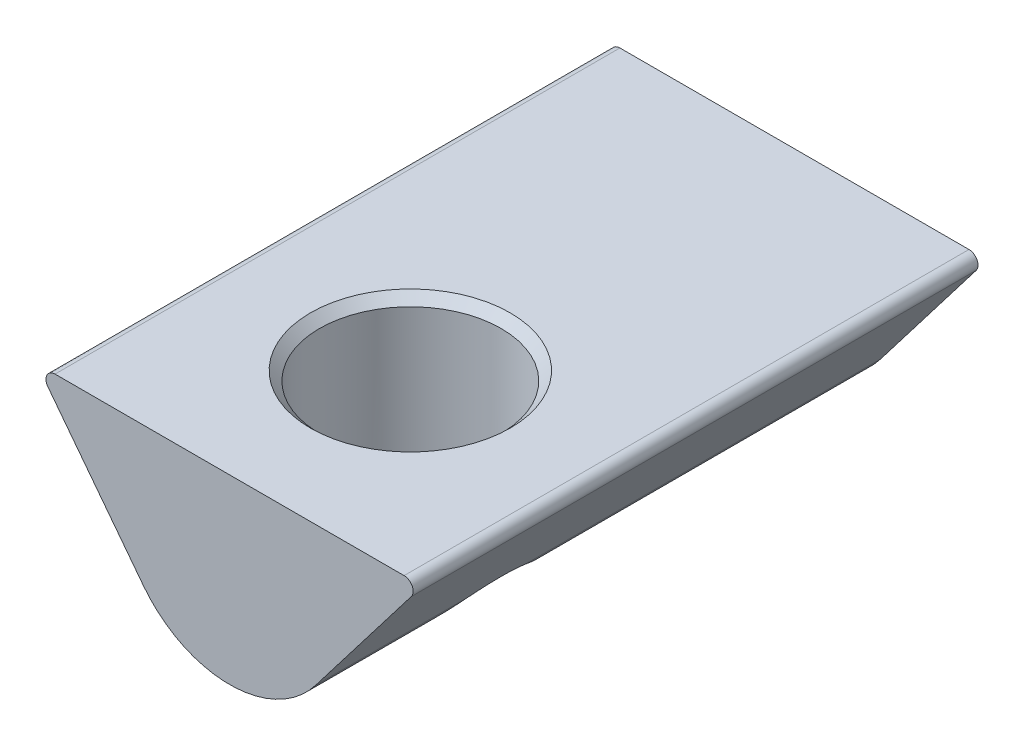
ISO-10303-21;
HEADER;
FILE_DESCRIPTION(('STEP AP214'),'2;1');
FILE_NAME('part.step','',(''),(''),'','','');
FILE_SCHEMA(('AUTOMOTIVE_DESIGN { 1 0 10303 214 1 1 1 1 }'));
ENDSEC;
DATA;
#1=APPLICATION_CONTEXT('core data for automotive mechanical design processes');
#2=APPLICATION_PROTOCOL_DEFINITION('international standard','automotive_design',2000,#1);
#3=PRODUCT_CONTEXT('',#1,'mechanical');
#4=PRODUCT('Part','Part','',(#3));
#5=PRODUCT_RELATED_PRODUCT_CATEGORY('part','',(#4));
#6=PRODUCT_DEFINITION_FORMATION('','',#4);
#7=PRODUCT_DEFINITION_CONTEXT('part definition',#1,'design');
#8=PRODUCT_DEFINITION('design','',#6,#7);
#9=PRODUCT_DEFINITION_SHAPE('','',#8);
#10=(LENGTH_UNIT() NAMED_UNIT(*) SI_UNIT(.MILLI.,.METRE.));
#11=(NAMED_UNIT(*) PLANE_ANGLE_UNIT() SI_UNIT($,.RADIAN.));
#12=(NAMED_UNIT(*) SI_UNIT($,.STERADIAN.) SOLID_ANGLE_UNIT());
#13=UNCERTAINTY_MEASURE_WITH_UNIT(LENGTH_MEASURE(1.E-05),#10,'distance_accuracy_value','');
#14=(GEOMETRIC_REPRESENTATION_CONTEXT(3) GLOBAL_UNCERTAINTY_ASSIGNED_CONTEXT((#13)) GLOBAL_UNIT_ASSIGNED_CONTEXT((#10,
#11,#12)) REPRESENTATION_CONTEXT('',''));
#15=CARTESIAN_POINT('',(0.,0.,0.));
#16=DIRECTION('',(0.,0.,1.));
#17=DIRECTION('',(1.,0.,0.));
#18=AXIS2_PLACEMENT_3D('',#15,#16,#17);
#19=CARTESIAN_POINT('',(20.678846244995,21.2515591218963,15.875));
#20=DIRECTION('',(0.,0.,-1.));
#21=DIRECTION('',(-1.,0.,0.));
#22=AXIS2_PLACEMENT_3D('',#19,#20,#21);
#23=CYLINDRICAL_SURFACE('',#22,3.04987684764088);
#24=DIRECTION('',(0.,0.,-1.));
#25=VECTOR('',#24,1.);
#26=CARTESIAN_POINT('',(23.0984762297093,19.3949117340363,15.875));
#27=LINE('',#26,#25);
#28=CARTESIAN_POINT('',(23.0984762297093,19.3949117340363,9.98157020765669));
#29=VERTEX_POINT('',#28);
#30=CARTESIAN_POINT('',(23.0984762297093,19.3949117340363,0.));
#31=VERTEX_POINT('',#30);
#32=EDGE_CURVE('E152',#29,#31,#27,.T.);
#33=ORIENTED_EDGE('',*,*,#32,.F.);
#34=CARTESIAN_POINT('',(23.0984762297093,19.3949117340363,9.98157020765669));
#35=CARTESIAN_POINT('',(23.0729910607301,19.3616518093463,9.90588643650475));
#36=CARTESIAN_POINT('',(23.0444060362908,19.3258576982573,9.832494447542));
#37=CARTESIAN_POINT('',(22.9813863376244,19.2509596465722,9.69015156439314));
#38=CARTESIAN_POINT('',(22.9469589409931,19.2118598537659,9.62119529042967));
#39=CARTESIAN_POINT('',(22.8723147344973,19.1317765949265,9.48699035002589));
#40=CARTESIAN_POINT('',(22.8320641401536,19.0907831589226,9.42176665435686));
#41=CARTESIAN_POINT('',(22.7460193493294,19.0083261210263,9.29535865730705));
#42=CARTESIAN_POINT('',(22.7002231329875,18.9668623528402,9.23417584033539));
#43=CARTESIAN_POINT('',(22.6032976497361,18.8846503298943,9.11614078498057));
#44=CARTESIAN_POINT('',(22.5521886465642,18.8439000022675,9.05927342636744));
#45=CARTESIAN_POINT('',(22.4445370571206,18.7638702036827,8.94986823668342));
#46=CARTESIAN_POINT('',(22.3879947577308,18.7245906552186,8.89733017729432));
#47=CARTESIAN_POINT('',(22.2104529149698,18.6104201269046,8.74697163006513));
#48=CARTESIAN_POINT('',(22.0811669320783,18.5388685265395,8.65594896207072));
#49=CARTESIAN_POINT('',(21.8404423962583,18.4293540410149,8.51892034650207));
#50=CARTESIAN_POINT('',(21.7338464253532,18.3875624813369,8.46741588720267));
#51=CARTESIAN_POINT('',(21.5111964971386,18.3151330569238,8.37884955454632));
#52=CARTESIAN_POINT('',(21.3951490972065,18.2844875384294,8.3417777693297));
#53=CARTESIAN_POINT('',(21.1553814938514,18.2366466756989,8.2841264460102));
#54=CARTESIAN_POINT('',(21.0316131754071,18.2195471948586,8.26366442821258));
#55=CARTESIAN_POINT('',(20.7812528215214,18.2008239512615,8.24126661766402));
#56=CARTESIAN_POINT('',(20.6546621812725,18.1991927047836,8.2393218660312));
#57=CARTESIAN_POINT('',(20.4173098302928,18.2108521691151,8.2532612940785));
#58=CARTESIAN_POINT('',(20.3063433499783,18.2225155732538,8.26720109630907));
#59=CARTESIAN_POINT('',(20.0889363113797,18.2572517185322,8.30893106453424));
#60=CARTESIAN_POINT('',(19.982495977392,18.280325024384,8.33672191606155));
#61=CARTESIAN_POINT('',(19.7738149784183,18.3369984330871,8.40552658988044));
#62=CARTESIAN_POINT('',(19.6717495237704,18.3708509017565,8.44685818339581));
#63=CARTESIAN_POINT('',(19.4762364008337,18.4468305001562,8.54071788091777));
#64=CARTESIAN_POINT('',(19.3827947720185,18.4889633651869,8.59325374756731));
#65=CARTESIAN_POINT('',(19.1643469656639,18.6002931042267,8.73431833028964));
#66=CARTESIAN_POINT('',(19.0446378094254,18.6730145319431,8.82827706066428));
#67=CARTESIAN_POINT('',(18.8256513904151,18.8256043885582,9.0330331117077));
#68=CARTESIAN_POINT('',(18.7264195071988,18.9054881400203,9.14386690494887));
#69=CARTESIAN_POINT('',(18.5972784941784,19.0218107021475,9.31586517702937));
#70=CARTESIAN_POINT('',(18.5591157569316,19.0581401224603,9.37108218490253));
#71=CARTESIAN_POINT('',(18.4870869784042,19.1301141326462,9.48466009959388));
#72=CARTESIAN_POINT('',(18.4532192518818,19.1657589864363,9.54301976043827));
#73=CARTESIAN_POINT('',(18.3900002431264,19.2353440400592,9.66273135402388));
#74=CARTESIAN_POINT('',(18.3606306730431,19.2692907428314,9.72406975867521));
#75=CARTESIAN_POINT('',(18.3064389094072,19.3344619169196,9.85020063857088));
#76=CARTESIAN_POINT('',(18.2816220673024,19.3656831623309,9.9149970645228));
#77=CARTESIAN_POINT('',(18.2592162602807,19.3949117340363,9.98157020765668));
#78=B_SPLINE_CURVE_WITH_KNOTS('',3,(#34,#35,#36,#37,#38,#39,#40,#41,#42,#43,#44,#45,#46,#47,#48,
#49,#50,#51,#52,#53,#54,#55,#56,#57,#58,#59,#60,#61,#62,#63,#64,#65,#66,#67,#68,#69,#70,#71,#72,
#73,#74,#75,#76,#77),.UNSPECIFIED.,.F.,.F.,(4,2,2,2,2,2,2,2,2,2,2,2,2,2,2,2,2,2,2,2,2,4),(0.,
0.259236084048795,0.518151587682971,0.778634429249544,1.03921243250584,1.29883068515625,
1.55843523730723,2.07564312141208,2.45087772932179,2.82585418261333,3.20346115922281,
3.58088543562899,3.9166471395847,4.2524254631108,4.59672793118124,4.94126972137637,
5.4445819506972,5.9489978645265,6.17782191071443,6.4065558931287,6.63433372083004,
6.86237759526639),.UNSPECIFIED.);
#79=CARTESIAN_POINT('',(18.2592162602807,19.3949117340363,9.98157020765669));
#80=VERTEX_POINT('',#79);
#81=EDGE_CURVE('E161',#29,#80,#78,.T.);
#82=ORIENTED_EDGE('',*,*,#81,.T.);
#83=DIRECTION('',(0.,0.,-1.));
#84=VECTOR('',#83,1.);
#85=CARTESIAN_POINT('',(18.2592162602807,19.3949117340363,15.875));
#86=LINE('',#85,#84);
#87=CARTESIAN_POINT('',(18.2592162602807,19.3949117340363,0.));
#88=VERTEX_POINT('',#87);
#89=EDGE_CURVE('E86',#80,#88,#86,.T.);
#90=ORIENTED_EDGE('',*,*,#89,.T.);
#91=CARTESIAN_POINT('',(20.678846244995,21.2515591218963,0.));
#92=DIRECTION('',(0.,0.,1.));
#93=DIRECTION('',(1.,0.,0.));
#94=AXIS2_PLACEMENT_3D('',#91,#92,#93);
#95=CIRCLE('',#94,3.04987684764088);
#96=EDGE_CURVE('E132',#88,#31,#95,.T.);
#97=ORIENTED_EDGE('',*,*,#96,.T.);
#98=EDGE_LOOP('',(#33,#82,#90,#97));
#99=FACE_BOUND('',#98,.T.);
#100=ADVANCED_FACE('F34',(#99),#23,.T.);
#101=CARTESIAN_POINT('',(18.2592162602807,19.3949117340363,15.875));
#102=VERTEX_POINT('',#101);
#103=CARTESIAN_POINT('',(18.2592162602807,19.3949117340363,11.6084297923433));
#104=VERTEX_POINT('',#103);
#105=EDGE_CURVE('E144',#102,#104,#86,.T.);
#106=ORIENTED_EDGE('',*,*,#105,.T.);
#107=CARTESIAN_POINT('',(18.2592162602807,19.3949117340363,11.6084297923433));
#108=CARTESIAN_POINT('',(18.2847014797293,19.3616517457281,11.6841137068755));
#109=CARTESIAN_POINT('',(18.3132865632125,19.3258575621394,11.7575058306976));
#110=CARTESIAN_POINT('',(18.3763064232477,19.2509593304373,11.8998490163147));
#111=CARTESIAN_POINT('',(18.4107339262214,19.2118594278203,11.9688054549172));
#112=CARTESIAN_POINT('',(18.4853782161445,19.1317761221928,12.1030104108276));
#113=CARTESIAN_POINT('',(18.5256287631642,19.0907827564625,12.1682339754314));
#114=CARTESIAN_POINT('',(18.6116733779941,19.008325899951,12.2946416687591));
#115=CARTESIAN_POINT('',(18.657469460795,18.9668622432775,12.3558243166468));
#116=CARTESIAN_POINT('',(18.7543913953415,18.8846532733081,12.4738549893639));
#117=CARTESIAN_POINT('',(18.8054966051926,18.8439058484992,12.5307184163364));
#118=CARTESIAN_POINT('',(18.913139638289,18.7638814793328,12.640116513459));
#119=CARTESIAN_POINT('',(18.9696771902149,18.7246044616715,12.6926513995556));
#120=CARTESIAN_POINT('',(19.1472220578543,18.6104302114162,12.8430155734873));
#121=CARTESIAN_POINT('',(19.2765196632129,18.5388728972368,12.9340456834417));
#122=CARTESIAN_POINT('',(19.5172858855283,18.429336532266,13.0711014781538));
#123=CARTESIAN_POINT('',(19.6239179831347,18.3875308210941,13.1226228571068));
#124=CARTESIAN_POINT('',(19.8465946531842,18.3151092067903,13.2111795761877));
#125=CARTESIAN_POINT('',(19.9626253462688,18.284477158277,13.248235823183));
#126=CARTESIAN_POINT('',(20.178456167469,18.2414016081892,13.300142678288));
#127=CARTESIAN_POINT('',(20.2770920493922,18.2265944094534,13.3178916162994));
#128=CARTESIAN_POINT('',(20.476757042617,18.2067323804414,13.3416726954326));
#129=CARTESIAN_POINT('',(20.577786155835,18.2016775579756,13.3477048271708));
#130=CARTESIAN_POINT('',(20.7999445734233,18.2016879256814,13.3476942156956));
#131=CARTESIAN_POINT('',(20.9210873794638,18.2089584474673,13.3390201068566));
#132=CARTESIAN_POINT('',(21.1593303044648,18.2373732312429,13.304966191829));
#133=CARTESIAN_POINT('',(21.2764273747776,18.2585277253507,13.2795740648622));
#134=CARTESIAN_POINT('',(21.5025947314249,18.3127427793439,13.2139890918811));
#135=CARTESIAN_POINT('',(21.6117091048076,18.3457308806922,13.1738862879987));
#136=CARTESIAN_POINT('',(21.8207254006519,18.4213224447704,13.0809346902221));
#137=CARTESIAN_POINT('',(21.9206225432387,18.4639308573643,13.0280793338921));
#138=CARTESIAN_POINT('',(22.1452539462075,18.5734534042563,12.8900316055631));
#139=CARTESIAN_POINT('',(22.2655297977446,18.6435316430247,12.8001066143267));
#140=CARTESIAN_POINT('',(22.4863887933145,18.7914287098241,12.6035974549958));
#141=CARTESIAN_POINT('',(22.5869244285369,18.869265548475,12.49697418037));
#142=CARTESIAN_POINT('',(22.7228408234887,18.9871699193447,12.3259066923562));
#143=CARTESIAN_POINT('',(22.765725848323,19.0267317839839,12.2669179115891));
#144=CARTESIAN_POINT('',(22.8464405998986,19.1052943213047,12.1452373816163));
#145=CARTESIAN_POINT('',(22.8842720890144,19.144295185374,12.0825469343894));
#146=CARTESIAN_POINT('',(22.9546281179721,19.2204933561365,11.953651454112));
#147=CARTESIAN_POINT('',(22.9871756764517,19.2576979608229,11.8874634269242));
#148=CARTESIAN_POINT('',(23.0469243763552,19.3290179088633,11.7510290354236));
#149=CARTESIAN_POINT('',(23.0741190826844,19.3631295076275,11.6807779161695));
#150=CARTESIAN_POINT('',(23.0984762297093,19.3949117340363,11.6084297923433));
#151=B_SPLINE_CURVE_WITH_KNOTS('',3,(#107,#108,#109,#110,#111,#112,#113,#114,#115,#116,#117,
#118,#119,#120,#121,#122,#123,#124,#125,#126,#127,#128,#129,#130,#131,#132,#133,#134,#135,#136,
#137,#138,#139,#140,#141,#142,#143,#144,#145,#146,#147,#148,#149,#150),.UNSPECIFIED.,.F.,.F.,(4,
2,2,2,2,2,2,2,2,2,2,2,2,2,2,2,2,2,2,2,2,4),(0.,0.259236575146356,0.518152747534118,
0.778635123492828,1.03921243228896,1.2988120593017,1.55839872729532,2.0756430014301,
2.45102085045048,2.82585412837456,3.12867762974668,3.43150137364087,3.79436914368525,
4.15750463836186,4.51845353855625,4.87958857992117,5.37413899771829,5.86986544191163,
6.11858384178819,6.36721527567163,6.614732700698,6.86254589296833),.UNSPECIFIED.);
#152=CARTESIAN_POINT('',(23.0984762297093,19.3949117340363,11.6084297923433));
#153=VERTEX_POINT('',#152);
#154=EDGE_CURVE('E155',#104,#153,#151,.T.);
#155=ORIENTED_EDGE('',*,*,#154,.T.);
#156=CARTESIAN_POINT('',(23.0984762297093,19.3949117340363,15.875));
#157=VERTEX_POINT('',#156);
#158=EDGE_CURVE('E153',#157,#153,#27,.T.);
#159=ORIENTED_EDGE('',*,*,#158,.F.);
#160=CARTESIAN_POINT('',(20.678846244995,21.2515591218963,15.875));
#161=DIRECTION('',(0.,0.,1.));
#162=DIRECTION('',(1.,0.,0.));
#163=AXIS2_PLACEMENT_3D('',#160,#161,#162);
#164=CIRCLE('',#163,3.04987684764088);
#165=EDGE_CURVE('E143',#102,#157,#164,.T.);
#166=ORIENTED_EDGE('',*,*,#165,.F.);
#167=EDGE_LOOP('',(#106,#155,#159,#166));
#168=FACE_BOUND('',#167,.T.);
#169=ADVANCED_FACE('F165',(#168),#23,.T.);
#170=CARTESIAN_POINT('',(23.0984762297093,19.3949117340363,15.875));
#171=DIRECTION('',(-0.793353340344176,0.608761428939727,0.));
#172=DIRECTION('',(-0.608761428939727,-0.793353340344176,0.));
#173=AXIS2_PLACEMENT_3D('',#170,#171,#172);
#174=PLANE('',#173);
#175=ORIENTED_EDGE('',*,*,#158,.T.);
#176=CARTESIAN_POINT('',(20.678846244995,16.2415885445015,10.795));
#177=DIRECTION('',(-0.793353340344176,0.608761428939727,0.));
#178=DIRECTION('',(0.608761428939727,0.793353340344176,0.));
#179=AXIS2_PLACEMENT_3D('',#176,#177,#178);
#180=ELLIPSE('',#179,4.19326829632753,2.5527);
#181=EDGE_CURVE('E49',#153,#29,#180,.T.);
#182=ORIENTED_EDGE('',*,*,#181,.T.);
#183=ORIENTED_EDGE('',*,*,#32,.T.);
#184=DIRECTION('',(0.608761428939727,0.793353340344176,0.));
#185=VECTOR('',#184,1.);
#186=CARTESIAN_POINT('',(23.0984762297093,19.3949117340363,0.));
#187=LINE('',#186,#185);
#188=CARTESIAN_POINT('',(25.7857006730844,22.8969708117925,0.));
#189=VERTEX_POINT('',#188);
#190=EDGE_CURVE('E134',#31,#189,#187,.T.);
#191=ORIENTED_EDGE('',*,*,#190,.T.);
#192=DIRECTION('',(0.,0.,-1.));
#193=VECTOR('',#192,1.);
#194=CARTESIAN_POINT('',(25.7857006730844,22.8969708117925,15.875));
#195=LINE('',#194,#193);
#196=CARTESIAN_POINT('',(25.7857006730844,22.8969708117925,15.875));
#197=VERTEX_POINT('',#196);
#198=EDGE_CURVE('E149',#197,#189,#195,.T.);
#199=ORIENTED_EDGE('',*,*,#198,.F.);
#200=DIRECTION('',(0.608761428939727,0.793353340344176,0.));
#201=VECTOR('',#200,1.);
#202=CARTESIAN_POINT('',(23.0984762297093,19.3949117340363,15.875));
#203=LINE('',#202,#201);
#204=EDGE_CURVE('E95',#157,#197,#203,.T.);
#205=ORIENTED_EDGE('',*,*,#204,.F.);
#206=EDGE_LOOP('',(#175,#182,#183,#191,#199,#205));
#207=FACE_BOUND('',#206,.T.);
#208=ADVANCED_FACE('F191',(#207),#174,.F.);
#209=CARTESIAN_POINT('',(25.5840648410249,23.0516914274475,15.875));
#210=DIRECTION('',(0.,0.,-1.));
#211=DIRECTION('',(-1.,0.,0.));
#212=AXIS2_PLACEMENT_3D('',#209,#210,#211);
#213=CYLINDRICAL_SURFACE('',#212,0.254156403970068);
#214=CARTESIAN_POINT('',(25.5840648410249,23.0516914274475,0.));
#215=DIRECTION('',(0.,0.,1.));
#216=DIRECTION('',(1.,0.,0.));
#217=AXIS2_PLACEMENT_3D('',#214,#215,#216);
#218=CIRCLE('',#217,0.254156403970068);
#219=CARTESIAN_POINT('',(25.5840648410249,23.3058478314176,0.));
#220=VERTEX_POINT('',#219);
#221=EDGE_CURVE('E136',#189,#220,#218,.T.);
#222=ORIENTED_EDGE('',*,*,#221,.T.);
#223=DIRECTION('',(0.,0.,-1.));
#224=VECTOR('',#223,1.);
#225=CARTESIAN_POINT('',(25.5840648410249,23.3058478314176,15.875));
#226=LINE('',#225,#224);
#227=CARTESIAN_POINT('',(25.5840648410249,23.3058478314176,15.875));
#228=VERTEX_POINT('',#227);
#229=EDGE_CURVE('E123',#228,#220,#226,.T.);
#230=ORIENTED_EDGE('',*,*,#229,.F.);
#231=CARTESIAN_POINT('',(25.5840648410249,23.0516914274475,15.875));
#232=DIRECTION('',(0.,0.,1.));
#233=DIRECTION('',(1.,0.,0.));
#234=AXIS2_PLACEMENT_3D('',#231,#232,#233);
#235=CIRCLE('',#234,0.254156403970068);
#236=EDGE_CURVE('E111',#197,#228,#235,.T.);
#237=ORIENTED_EDGE('',*,*,#236,.F.);
#238=ORIENTED_EDGE('',*,*,#198,.T.);
#239=EDGE_LOOP('',(#222,#230,#237,#238));
#240=FACE_BOUND('',#239,.T.);
#241=ADVANCED_FACE('F188',(#240),#213,.T.);
#242=CARTESIAN_POINT('',(15.7736276489651,23.3058478314176,15.875));
#243=DIRECTION('',(0.,-1.,0.));
#244=DIRECTION('',(1.,0.,0.));
#245=AXIS2_PLACEMENT_3D('',#242,#243,#244);
#246=PLANE('',#245);
#247=CARTESIAN_POINT('',(20.678846244995,23.3058478314176,10.795));
#248=DIRECTION('',(0.,-1.,0.));
#249=DIRECTION('',(1.,0.,0.));
#250=AXIS2_PLACEMENT_3D('',#247,#248,#249);
#251=CIRCLE('',#250,2.80670000000001);
#252=CARTESIAN_POINT('',(23.485546244995,23.3058478314176,10.795));
#253=VERTEX_POINT('',#252);
#254=EDGE_CURVE('E11',#253,#253,#251,.T.);
#255=ORIENTED_EDGE('',*,*,#254,.T.);
#256=EDGE_LOOP('',(#255));
#257=FACE_BOUND('',#256,.T.);
#258=DIRECTION('',(-1.,0.,0.));
#259=VECTOR('',#258,1.);
#260=CARTESIAN_POINT('',(15.7736276489651,23.3058478314176,0.));
#261=LINE('',#260,#259);
#262=CARTESIAN_POINT('',(15.7736276489651,23.3058478314176,0.));
#263=VERTEX_POINT('',#262);
#264=EDGE_CURVE('E120',#220,#263,#261,.T.);
#265=ORIENTED_EDGE('',*,*,#264,.T.);
#266=DIRECTION('',(0.,0.,-1.));
#267=VECTOR('',#266,1.);
#268=CARTESIAN_POINT('',(15.7736276489651,23.3058478314176,15.875));
#269=LINE('',#268,#267);
#270=CARTESIAN_POINT('',(15.7736276489651,23.3058478314176,15.875));
#271=VERTEX_POINT('',#270);
#272=EDGE_CURVE('E117',#271,#263,#269,.T.);
#273=ORIENTED_EDGE('',*,*,#272,.F.);
#274=DIRECTION('',(-1.,0.,0.));
#275=VECTOR('',#274,1.);
#276=CARTESIAN_POINT('',(15.7736276489651,23.3058478314176,15.875));
#277=LINE('',#276,#275);
#278=EDGE_CURVE('E104',#228,#271,#277,.T.);
#279=ORIENTED_EDGE('',*,*,#278,.F.);
#280=ORIENTED_EDGE('',*,*,#229,.T.);
#281=EDGE_LOOP('',(#265,#273,#279,#280));
#282=FACE_BOUND('',#281,.T.);
#283=ADVANCED_FACE('F118',(#257,#282),#246,.F.);
#284=CARTESIAN_POINT('',(15.7736276489651,23.0516914274475,15.875));
#285=DIRECTION('',(0.,0.,-1.));
#286=DIRECTION('',(-1.,0.,0.));
#287=AXIS2_PLACEMENT_3D('',#284,#285,#286);
#288=CYLINDRICAL_SURFACE('',#287,0.254156403970074);
#289=CARTESIAN_POINT('',(15.7736276489651,23.0516914274475,0.));
#290=DIRECTION('',(0.,0.,1.));
#291=DIRECTION('',(1.,0.,0.));
#292=AXIS2_PLACEMENT_3D('',#289,#290,#291);
#293=CIRCLE('',#292,0.254156403970074);
#294=CARTESIAN_POINT('',(15.5719918169055,22.8969708117925,0.));
#295=VERTEX_POINT('',#294);
#296=EDGE_CURVE('E139',#263,#295,#293,.T.);
#297=ORIENTED_EDGE('',*,*,#296,.T.);
#298=DIRECTION('',(0.,0.,-1.));
#299=VECTOR('',#298,1.);
#300=CARTESIAN_POINT('',(15.5719918169055,22.8969708117925,15.875));
#301=LINE('',#300,#299);
#302=CARTESIAN_POINT('',(15.5719918169055,22.8969708117925,15.875));
#303=VERTEX_POINT('',#302);
#304=EDGE_CURVE('E124',#303,#295,#301,.T.);
#305=ORIENTED_EDGE('',*,*,#304,.F.);
#306=CARTESIAN_POINT('',(15.7736276489651,23.0516914274475,15.875));
#307=DIRECTION('',(0.,0.,1.));
#308=DIRECTION('',(1.,0.,0.));
#309=AXIS2_PLACEMENT_3D('',#306,#307,#308);
#310=CIRCLE('',#309,0.254156403970074);
#311=EDGE_CURVE('E108',#271,#303,#310,.T.);
#312=ORIENTED_EDGE('',*,*,#311,.F.);
#313=ORIENTED_EDGE('',*,*,#272,.T.);
#314=EDGE_LOOP('',(#297,#305,#312,#313));
#315=FACE_BOUND('',#314,.T.);
#316=ADVANCED_FACE('F126',(#315),#288,.T.);
#317=CARTESIAN_POINT('',(15.5719918169055,22.8969708117925,15.875));
#318=DIRECTION('',(0.793353340344175,0.608761428939728,0.));
#319=DIRECTION('',(-0.608761428939728,0.793353340344175,0.));
#320=AXIS2_PLACEMENT_3D('',#317,#318,#319);
#321=PLANE('',#320);
#322=ORIENTED_EDGE('',*,*,#89,.F.);
#323=CARTESIAN_POINT('',(20.678846244995,16.2415885445015,10.795));
#324=DIRECTION('',(0.793353340344175,0.608761428939728,0.));
#325=DIRECTION('',(-0.608761428939728,0.793353340344175,0.));
#326=AXIS2_PLACEMENT_3D('',#323,#324,#325);
#327=ELLIPSE('',#326,4.19326829632752,2.5527);
#328=EDGE_CURVE('E211',#80,#104,#327,.T.);
#329=ORIENTED_EDGE('',*,*,#328,.T.);
#330=ORIENTED_EDGE('',*,*,#105,.F.);
#331=DIRECTION('',(0.608761428939728,-0.793353340344175,0.));
#332=VECTOR('',#331,1.);
#333=CARTESIAN_POINT('',(15.5719918169055,22.8969708117925,15.875));
#334=LINE('',#333,#332);
#335=EDGE_CURVE('E58',#303,#102,#334,.T.);
#336=ORIENTED_EDGE('',*,*,#335,.F.);
#337=ORIENTED_EDGE('',*,*,#304,.T.);
#338=DIRECTION('',(0.608761428939728,-0.793353340344175,0.));
#339=VECTOR('',#338,1.);
#340=CARTESIAN_POINT('',(15.5719918169055,22.8969708117925,0.));
#341=LINE('',#340,#339);
#342=EDGE_CURVE('E141',#295,#88,#341,.T.);
#343=ORIENTED_EDGE('',*,*,#342,.T.);
#344=EDGE_LOOP('',(#322,#329,#330,#336,#337,#343));
#345=FACE_BOUND('',#344,.T.);
#346=ADVANCED_FACE('F177',(#345),#321,.F.);
#347=CARTESIAN_POINT('',(20.678846244995,21.2515591218963,15.875));
#348=DIRECTION('',(0.,0.,1.));
#349=DIRECTION('',(1.,0.,0.));
#350=AXIS2_PLACEMENT_3D('',#347,#348,#349);
#351=PLANE('',#350);
#352=ORIENTED_EDGE('',*,*,#165,.T.);
#353=ORIENTED_EDGE('',*,*,#204,.T.);
#354=ORIENTED_EDGE('',*,*,#236,.T.);
#355=ORIENTED_EDGE('',*,*,#278,.T.);
#356=ORIENTED_EDGE('',*,*,#311,.T.);
#357=ORIENTED_EDGE('',*,*,#335,.T.);
#358=EDGE_LOOP('',(#352,#353,#354,#355,#356,#357));
#359=FACE_BOUND('',#358,.T.);
#360=ADVANCED_FACE('F106',(#359),#351,.T.);
#361=CARTESIAN_POINT('',(20.678846244995,21.2515591218963,0.));
#362=DIRECTION('',(0.,0.,1.));
#363=DIRECTION('',(1.,0.,0.));
#364=AXIS2_PLACEMENT_3D('',#361,#362,#363);
#365=PLANE('',#364);
#366=ORIENTED_EDGE('',*,*,#96,.F.);
#367=ORIENTED_EDGE('',*,*,#342,.F.);
#368=ORIENTED_EDGE('',*,*,#296,.F.);
#369=ORIENTED_EDGE('',*,*,#264,.F.);
#370=ORIENTED_EDGE('',*,*,#221,.F.);
#371=ORIENTED_EDGE('',*,*,#190,.F.);
#372=EDGE_LOOP('',(#366,#367,#368,#369,#370,#371));
#373=FACE_BOUND('',#372,.T.);
#374=ADVANCED_FACE('F172',(#373),#365,.F.);
#375=CARTESIAN_POINT('',(20.678846244995,23.3058478314176,10.795));
#376=DIRECTION('',(0.,1.,0.));
#377=DIRECTION('',(0.,0.,1.));
#378=AXIS2_PLACEMENT_3D('',#375,#376,#377);
#379=CYLINDRICAL_SURFACE('',#378,2.5527);
#380=CARTESIAN_POINT('',(20.678846244995,23.0518478314176,10.795));
#381=DIRECTION('',(0.,-1.,0.));
#382=DIRECTION('',(0.,0.,-1.));
#383=AXIS2_PLACEMENT_3D('',#380,#381,#382);
#384=CIRCLE('',#383,2.5527);
#385=CARTESIAN_POINT('',(20.678846244995,23.0518478314176,8.2423));
#386=VERTEX_POINT('',#385);
#387=EDGE_CURVE('E42',#386,#386,#384,.F.);
#388=ORIENTED_EDGE('',*,*,#387,.T.);
#389=EDGE_LOOP('',(#388));
#390=FACE_BOUND('',#389,.T.);
#391=ORIENTED_EDGE('',*,*,#181,.F.);
#392=ORIENTED_EDGE('',*,*,#154,.F.);
#393=ORIENTED_EDGE('',*,*,#328,.F.);
#394=ORIENTED_EDGE('',*,*,#81,.F.);
#395=EDGE_LOOP('',(#391,#392,#393,#394));
#396=FACE_BOUND('',#395,.T.);
#397=ADVANCED_FACE('F168',(#390,#396),#379,.F.);
#398=CARTESIAN_POINT('',(20.678846244995,23.0518478314176,10.795));
#399=DIRECTION('',(0.,1.,0.));
#400=DIRECTION('',(0.,0.,1.));
#401=AXIS2_PLACEMENT_3D('',#398,#399,#400);
#402=CONICAL_SURFACE('',#401,2.5527,0.785398163397462);
#403=ORIENTED_EDGE('',*,*,#254,.F.);
#404=EDGE_LOOP('',(#403));
#405=FACE_BOUND('',#404,.T.);
#406=ORIENTED_EDGE('',*,*,#387,.F.);
#407=EDGE_LOOP('',(#406));
#408=FACE_BOUND('',#407,.T.);
#409=ADVANCED_FACE('F36',(#405,#408),#402,.F.);
#410=CLOSED_SHELL('',(#100,#169,#208,#241,#283,#316,#346,#360,#374,#397,#409));
#411=MANIFOLD_SOLID_BREP('B2',#410);
#412=ADVANCED_BREP_SHAPE_REPRESENTATION('',(#18,#411),#14);
#413=SHAPE_DEFINITION_REPRESENTATION(#9,#412);
ENDSEC;
END-ISO-10303-21;
